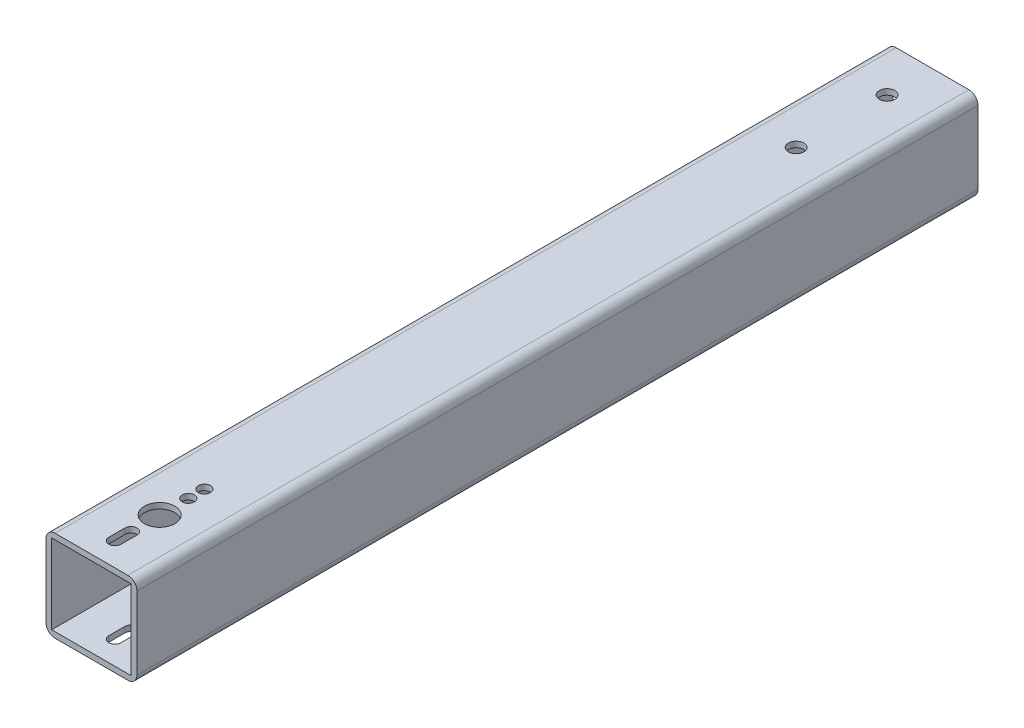
ISO-10303-21;
HEADER;
FILE_DESCRIPTION(('STEP AP214'),'2;1');
FILE_NAME('part.step','',(''),(''),'','','');
FILE_SCHEMA(('AUTOMOTIVE_DESIGN { 1 0 10303 214 1 1 1 1 }'));
ENDSEC;
DATA;
#1=APPLICATION_CONTEXT('core data for automotive mechanical design processes');
#2=APPLICATION_PROTOCOL_DEFINITION('international standard','automotive_design',2000,#1);
#3=PRODUCT_CONTEXT('',#1,'mechanical');
#4=PRODUCT('Part','Part','',(#3));
#5=PRODUCT_RELATED_PRODUCT_CATEGORY('part','',(#4));
#6=PRODUCT_DEFINITION_FORMATION('','',#4);
#7=PRODUCT_DEFINITION_CONTEXT('part definition',#1,'design');
#8=PRODUCT_DEFINITION('design','',#6,#7);
#9=PRODUCT_DEFINITION_SHAPE('','',#8);
#10=(LENGTH_UNIT() NAMED_UNIT(*) SI_UNIT(.MILLI.,.METRE.));
#11=(NAMED_UNIT(*) PLANE_ANGLE_UNIT() SI_UNIT($,.RADIAN.));
#12=(NAMED_UNIT(*) SI_UNIT($,.STERADIAN.) SOLID_ANGLE_UNIT());
#13=UNCERTAINTY_MEASURE_WITH_UNIT(LENGTH_MEASURE(1.E-05),#10,'distance_accuracy_value','');
#14=(GEOMETRIC_REPRESENTATION_CONTEXT(3) GLOBAL_UNCERTAINTY_ASSIGNED_CONTEXT((#13)) GLOBAL_UNIT_ASSIGNED_CONTEXT((#10,
#11,#12)) REPRESENTATION_CONTEXT('',''));
#15=CARTESIAN_POINT('',(0.,0.,0.));
#16=DIRECTION('',(0.,0.,1.));
#17=DIRECTION('',(1.,0.,0.));
#18=AXIS2_PLACEMENT_3D('',#15,#16,#17);
#19=CARTESIAN_POINT('',(0.,0.,234.95));
#20=DIRECTION('',(0.,0.,1.));
#21=DIRECTION('',(1.,0.,0.));
#22=AXIS2_PLACEMENT_3D('',#19,#20,#21);
#23=PLANE('',#22);
#24=DIRECTION('',(1.,0.,0.));
#25=VECTOR('',#24,1.);
#26=CARTESIAN_POINT('',(-24.2595918367347,-13.9751836734694,234.95));
#27=LINE('',#26,#25);
#28=CARTESIAN_POINT('',(-21.7195918367347,-13.9751836734694,234.95));
#29=VERTEX_POINT('',#28);
#30=CARTESIAN_POINT('',(-1.39959183673471,-13.9751836734694,234.95));
#31=VERTEX_POINT('',#30);
#32=EDGE_CURVE('E289',#29,#31,#27,.T.);
#33=ORIENTED_EDGE('',*,*,#32,.T.);
#34=CARTESIAN_POINT('',(-1.3995918367347,-11.4351836734694,234.95));
#35=DIRECTION('',(0.,0.,1.));
#36=DIRECTION('',(1.,0.,0.));
#37=AXIS2_PLACEMENT_3D('',#34,#35,#36);
#38=CIRCLE('',#37,2.54);
#39=CARTESIAN_POINT('',(1.1404081632653,-11.4351836734694,234.95));
#40=VERTEX_POINT('',#39);
#41=EDGE_CURVE('E333',#31,#40,#38,.T.);
#42=ORIENTED_EDGE('',*,*,#41,.T.);
#43=DIRECTION('',(0.,1.,0.));
#44=VECTOR('',#43,1.);
#45=CARTESIAN_POINT('',(1.1404081632653,11.4248163265306,234.95));
#46=LINE('',#45,#44);
#47=CARTESIAN_POINT('',(1.1404081632653,8.88481632653061,234.95));
#48=VERTEX_POINT('',#47);
#49=EDGE_CURVE('E293',#40,#48,#46,.T.);
#50=ORIENTED_EDGE('',*,*,#49,.T.);
#51=CARTESIAN_POINT('',(-1.3995918367347,8.88481632653061,234.95));
#52=DIRECTION('',(0.,0.,1.));
#53=DIRECTION('',(1.,0.,0.));
#54=AXIS2_PLACEMENT_3D('',#51,#52,#53);
#55=CIRCLE('',#54,2.54);
#56=CARTESIAN_POINT('',(-1.3995918367347,11.4248163265306,234.95));
#57=VERTEX_POINT('',#56);
#58=EDGE_CURVE('E327',#48,#57,#55,.T.);
#59=ORIENTED_EDGE('',*,*,#58,.T.);
#60=DIRECTION('',(-1.,0.,0.));
#61=VECTOR('',#60,1.);
#62=CARTESIAN_POINT('',(-24.2595918367347,11.4248163265306,234.95));
#63=LINE('',#62,#61);
#64=CARTESIAN_POINT('',(-21.7195918367347,11.4248163265306,234.95));
#65=VERTEX_POINT('',#64);
#66=EDGE_CURVE('E296',#57,#65,#63,.T.);
#67=ORIENTED_EDGE('',*,*,#66,.T.);
#68=CARTESIAN_POINT('',(-21.7195918367347,8.88481632653061,234.95));
#69=DIRECTION('',(0.,0.,1.));
#70=DIRECTION('',(1.,0.,0.));
#71=AXIS2_PLACEMENT_3D('',#68,#69,#70);
#72=CIRCLE('',#71,2.54);
#73=CARTESIAN_POINT('',(-24.2595918367347,8.88481632653061,234.95));
#74=VERTEX_POINT('',#73);
#75=EDGE_CURVE('E329',#65,#74,#72,.T.);
#76=ORIENTED_EDGE('',*,*,#75,.T.);
#77=DIRECTION('',(0.,-1.,0.));
#78=VECTOR('',#77,1.);
#79=CARTESIAN_POINT('',(-24.2595918367347,11.4248163265306,234.95));
#80=LINE('',#79,#78);
#81=CARTESIAN_POINT('',(-24.2595918367347,-11.4351836734694,234.95));
#82=VERTEX_POINT('',#81);
#83=EDGE_CURVE('E286',#74,#82,#80,.T.);
#84=ORIENTED_EDGE('',*,*,#83,.T.);
#85=CARTESIAN_POINT('',(-21.7195918367347,-11.4351836734694,234.95));
#86=DIRECTION('',(0.,0.,1.));
#87=DIRECTION('',(1.,0.,0.));
#88=AXIS2_PLACEMENT_3D('',#85,#86,#87);
#89=CIRCLE('',#88,2.54);
#90=EDGE_CURVE('E331',#82,#29,#89,.T.);
#91=ORIENTED_EDGE('',*,*,#90,.T.);
#92=EDGE_LOOP('',(#33,#42,#50,#59,#67,#76,#84,#91));
#93=FACE_BOUND('',#92,.T.);
#94=DIRECTION('',(1.,0.,0.));
#95=VECTOR('',#94,1.);
#96=CARTESIAN_POINT('',(-22.6720918367347,-12.3876836734694,234.95));
#97=LINE('',#96,#95);
#98=CARTESIAN_POINT('',(-22.6720918367347,-12.3876836734694,234.95));
#99=VERTEX_POINT('',#98);
#100=CARTESIAN_POINT('',(-0.447091836734699,-12.3876836734694,234.95));
#101=VERTEX_POINT('',#100);
#102=EDGE_CURVE('E257',#99,#101,#97,.T.);
#103=ORIENTED_EDGE('',*,*,#102,.F.);
#104=DIRECTION('',(0.,-1.,0.));
#105=VECTOR('',#104,1.);
#106=CARTESIAN_POINT('',(-22.6720918367347,9.83731632653061,234.95));
#107=LINE('',#106,#105);
#108=CARTESIAN_POINT('',(-22.6720918367347,9.83731632653061,234.95));
#109=VERTEX_POINT('',#108);
#110=EDGE_CURVE('E255',#109,#99,#107,.T.);
#111=ORIENTED_EDGE('',*,*,#110,.F.);
#112=DIRECTION('',(-1.,0.,0.));
#113=VECTOR('',#112,1.);
#114=CARTESIAN_POINT('',(-22.6720918367347,9.83731632653061,234.95));
#115=LINE('',#114,#113);
#116=CARTESIAN_POINT('',(-0.447091836734703,9.83731632653061,234.95));
#117=VERTEX_POINT('',#116);
#118=EDGE_CURVE('E263',#117,#109,#115,.T.);
#119=ORIENTED_EDGE('',*,*,#118,.F.);
#120=DIRECTION('',(0.,1.,0.));
#121=VECTOR('',#120,1.);
#122=CARTESIAN_POINT('',(-0.447091836734703,9.83731632653061,234.95));
#123=LINE('',#122,#121);
#124=EDGE_CURVE('E260',#101,#117,#123,.T.);
#125=ORIENTED_EDGE('',*,*,#124,.F.);
#126=EDGE_LOOP('',(#103,#111,#119,#125));
#127=FACE_BOUND('',#126,.T.);
#128=ADVANCED_FACE('F35',(#93,#127),#23,.T.);
#129=CARTESIAN_POINT('',(0.,0.,0.));
#130=DIRECTION('',(0.,0.,1.));
#131=DIRECTION('',(1.,0.,0.));
#132=AXIS2_PLACEMENT_3D('',#129,#130,#131);
#133=PLANE('',#132);
#134=DIRECTION('',(0.,1.,0.));
#135=VECTOR('',#134,1.);
#136=CARTESIAN_POINT('',(1.1404081632653,11.4248163265306,0.));
#137=LINE('',#136,#135);
#138=CARTESIAN_POINT('',(1.1404081632653,-11.4351836734694,0.));
#139=VERTEX_POINT('',#138);
#140=CARTESIAN_POINT('',(1.1404081632653,8.88481632653061,0.));
#141=VERTEX_POINT('',#140);
#142=EDGE_CURVE('E305',#139,#141,#137,.T.);
#143=ORIENTED_EDGE('',*,*,#142,.F.);
#144=CARTESIAN_POINT('',(-1.3995918367347,-11.4351836734694,0.));
#145=DIRECTION('',(0.,0.,1.));
#146=DIRECTION('',(1.,0.,0.));
#147=AXIS2_PLACEMENT_3D('',#144,#145,#146);
#148=CIRCLE('',#147,2.54);
#149=CARTESIAN_POINT('',(-1.39959183673471,-13.9751836734694,0.));
#150=VERTEX_POINT('',#149);
#151=EDGE_CURVE('E320',#139,#150,#148,.F.);
#152=ORIENTED_EDGE('',*,*,#151,.T.);
#153=DIRECTION('',(1.,0.,0.));
#154=VECTOR('',#153,1.);
#155=CARTESIAN_POINT('',(-24.2595918367347,-13.9751836734694,0.));
#156=LINE('',#155,#154);
#157=CARTESIAN_POINT('',(-21.7195918367347,-13.9751836734694,0.));
#158=VERTEX_POINT('',#157);
#159=EDGE_CURVE('E302',#158,#150,#156,.T.);
#160=ORIENTED_EDGE('',*,*,#159,.F.);
#161=CARTESIAN_POINT('',(-21.7195918367347,-11.4351836734694,0.));
#162=DIRECTION('',(0.,0.,1.));
#163=DIRECTION('',(1.,0.,0.));
#164=AXIS2_PLACEMENT_3D('',#161,#162,#163);
#165=CIRCLE('',#164,2.54);
#166=CARTESIAN_POINT('',(-24.2595918367347,-11.4351836734694,0.));
#167=VERTEX_POINT('',#166);
#168=EDGE_CURVE('E318',#158,#167,#165,.F.);
#169=ORIENTED_EDGE('',*,*,#168,.T.);
#170=DIRECTION('',(0.,-1.,0.));
#171=VECTOR('',#170,1.);
#172=CARTESIAN_POINT('',(-24.2595918367347,11.4248163265306,0.));
#173=LINE('',#172,#171);
#174=CARTESIAN_POINT('',(-24.2595918367347,8.88481632653061,0.));
#175=VERTEX_POINT('',#174);
#176=EDGE_CURVE('E285',#175,#167,#173,.T.);
#177=ORIENTED_EDGE('',*,*,#176,.F.);
#178=CARTESIAN_POINT('',(-21.7195918367347,8.88481632653061,0.));
#179=DIRECTION('',(0.,0.,1.));
#180=DIRECTION('',(1.,0.,0.));
#181=AXIS2_PLACEMENT_3D('',#178,#179,#180);
#182=CIRCLE('',#181,2.54);
#183=CARTESIAN_POINT('',(-21.7195918367347,11.4248163265306,0.));
#184=VERTEX_POINT('',#183);
#185=EDGE_CURVE('E316',#175,#184,#182,.F.);
#186=ORIENTED_EDGE('',*,*,#185,.T.);
#187=DIRECTION('',(-1.,0.,0.));
#188=VECTOR('',#187,1.);
#189=CARTESIAN_POINT('',(-24.2595918367347,11.4248163265306,0.));
#190=LINE('',#189,#188);
#191=CARTESIAN_POINT('',(-1.3995918367347,11.4248163265306,0.));
#192=VERTEX_POINT('',#191);
#193=EDGE_CURVE('E290',#192,#184,#190,.T.);
#194=ORIENTED_EDGE('',*,*,#193,.F.);
#195=CARTESIAN_POINT('',(-1.3995918367347,8.88481632653061,0.));
#196=DIRECTION('',(0.,0.,1.));
#197=DIRECTION('',(1.,0.,0.));
#198=AXIS2_PLACEMENT_3D('',#195,#196,#197);
#199=CIRCLE('',#198,2.54);
#200=EDGE_CURVE('E314',#192,#141,#199,.F.);
#201=ORIENTED_EDGE('',*,*,#200,.T.);
#202=EDGE_LOOP('',(#143,#152,#160,#169,#177,#186,#194,#201));
#203=FACE_BOUND('',#202,.T.);
#204=DIRECTION('',(0.,-1.,0.));
#205=VECTOR('',#204,1.);
#206=CARTESIAN_POINT('',(-22.6720918367347,9.83731632653061,0.));
#207=LINE('',#206,#205);
#208=CARTESIAN_POINT('',(-22.6720918367347,9.83731632653061,0.));
#209=VERTEX_POINT('',#208);
#210=CARTESIAN_POINT('',(-22.6720918367347,-12.3876836734694,0.));
#211=VERTEX_POINT('',#210);
#212=EDGE_CURVE('E254',#209,#211,#207,.T.);
#213=ORIENTED_EDGE('',*,*,#212,.T.);
#214=DIRECTION('',(1.,0.,0.));
#215=VECTOR('',#214,1.);
#216=CARTESIAN_POINT('',(-22.6720918367347,-12.3876836734694,0.));
#217=LINE('',#216,#215);
#218=CARTESIAN_POINT('',(-0.447091836734699,-12.3876836734694,0.));
#219=VERTEX_POINT('',#218);
#220=EDGE_CURVE('E268',#211,#219,#217,.T.);
#221=ORIENTED_EDGE('',*,*,#220,.T.);
#222=DIRECTION('',(0.,1.,0.));
#223=VECTOR('',#222,1.);
#224=CARTESIAN_POINT('',(-0.447091836734703,9.83731632653061,0.));
#225=LINE('',#224,#223);
#226=CARTESIAN_POINT('',(-0.447091836734703,9.83731632653061,0.));
#227=VERTEX_POINT('',#226);
#228=EDGE_CURVE('E271',#219,#227,#225,.T.);
#229=ORIENTED_EDGE('',*,*,#228,.T.);
#230=DIRECTION('',(-1.,0.,0.));
#231=VECTOR('',#230,1.);
#232=CARTESIAN_POINT('',(-22.6720918367347,9.83731632653061,0.));
#233=LINE('',#232,#231);
#234=EDGE_CURVE('E258',#227,#209,#233,.T.);
#235=ORIENTED_EDGE('',*,*,#234,.T.);
#236=EDGE_LOOP('',(#213,#221,#229,#235));
#237=FACE_BOUND('',#236,.T.);
#238=ADVANCED_FACE('F416',(#203,#237),#133,.F.);
#239=CARTESIAN_POINT('',(-24.2595918367347,11.4248163265306,234.95));
#240=DIRECTION('',(1.,0.,0.));
#241=DIRECTION('',(0.,0.,-1.));
#242=AXIS2_PLACEMENT_3D('',#239,#240,#241);
#243=PLANE('',#242);
#244=ORIENTED_EDGE('',*,*,#176,.T.);
#245=DIRECTION('',(0.,0.,-1.));
#246=VECTOR('',#245,1.);
#247=CARTESIAN_POINT('',(-24.2595918367347,-11.4351836734694,234.95));
#248=LINE('',#247,#246);
#249=EDGE_CURVE('E338',#167,#82,#248,.F.);
#250=ORIENTED_EDGE('',*,*,#249,.T.);
#251=ORIENTED_EDGE('',*,*,#83,.F.);
#252=DIRECTION('',(0.,0.,-1.));
#253=VECTOR('',#252,1.);
#254=CARTESIAN_POINT('',(-24.2595918367347,8.88481632653061,234.95));
#255=LINE('',#254,#253);
#256=EDGE_CURVE('E335',#74,#175,#255,.T.);
#257=ORIENTED_EDGE('',*,*,#256,.T.);
#258=EDGE_LOOP('',(#244,#250,#251,#257));
#259=FACE_BOUND('',#258,.T.);
#260=ADVANCED_FACE('F422',(#259),#243,.F.);
#261=CARTESIAN_POINT('',(-24.2595918367347,-13.9751836734694,234.95));
#262=DIRECTION('',(0.,1.,0.));
#263=DIRECTION('',(0.,0.,1.));
#264=AXIS2_PLACEMENT_3D('',#261,#262,#263);
#265=PLANE('',#264);
#266=CARTESIAN_POINT('',(-11.5595918367347,-13.9751836734694,203.4));
#267=DIRECTION('',(0.,1.,0.));
#268=DIRECTION('',(0.,0.,1.));
#269=AXIS2_PLACEMENT_3D('',#266,#267,#268);
#270=CIRCLE('',#269,1.7000000000001);
#271=CARTESIAN_POINT('',(-11.5595918367347,-13.9751836734694,205.1));
#272=VERTEX_POINT('',#271);
#273=EDGE_CURVE('E197',#272,#272,#270,.T.);
#274=ORIENTED_EDGE('',*,*,#273,.T.);
#275=EDGE_LOOP('',(#274));
#276=FACE_BOUND('',#275,.T.);
#277=CARTESIAN_POINT('',(-11.5595918367347,-13.9751836734694,215.9));
#278=DIRECTION('',(0.,1.,0.));
#279=DIRECTION('',(0.,0.,1.));
#280=AXIS2_PLACEMENT_3D('',#277,#278,#279);
#281=CIRCLE('',#280,4.25);
#282=CARTESIAN_POINT('',(-11.5595918367347,-13.9751836734694,220.15));
#283=VERTEX_POINT('',#282);
#284=EDGE_CURVE('E201',#283,#283,#281,.T.);
#285=ORIENTED_EDGE('',*,*,#284,.T.);
#286=EDGE_LOOP('',(#285));
#287=FACE_BOUND('',#286,.T.);
#288=DIRECTION('',(0.,0.,-1.));
#289=VECTOR('',#288,1.);
#290=CARTESIAN_POINT('',(-9.85959183673465,-13.9751836734694,223.9));
#291=LINE('',#290,#289);
#292=CARTESIAN_POINT('',(-9.85959183673465,-13.9751836734694,228.4));
#293=VERTEX_POINT('',#292);
#294=CARTESIAN_POINT('',(-9.85959183673465,-13.9751836734694,223.9));
#295=VERTEX_POINT('',#294);
#296=EDGE_CURVE('E383',#293,#295,#291,.T.);
#297=ORIENTED_EDGE('',*,*,#296,.T.);
#298=CARTESIAN_POINT('',(-11.5595918367347,-13.9751836734694,223.9));
#299=DIRECTION('',(0.,1.,0.));
#300=DIRECTION('',(0.,0.,1.));
#301=AXIS2_PLACEMENT_3D('',#298,#299,#300);
#302=CIRCLE('',#301,1.70000000000004);
#303=CARTESIAN_POINT('',(-13.2595918367347,-13.9751836734694,223.9));
#304=VERTEX_POINT('',#303);
#305=EDGE_CURVE('E388',#295,#304,#302,.T.);
#306=ORIENTED_EDGE('',*,*,#305,.T.);
#307=DIRECTION('',(0.,0.,1.));
#308=VECTOR('',#307,1.);
#309=CARTESIAN_POINT('',(-13.2595918367347,-13.9751836734694,223.9));
#310=LINE('',#309,#308);
#311=CARTESIAN_POINT('',(-13.2595918367347,-13.9751836734694,228.4));
#312=VERTEX_POINT('',#311);
#313=EDGE_CURVE('E176',#304,#312,#310,.T.);
#314=ORIENTED_EDGE('',*,*,#313,.T.);
#315=CARTESIAN_POINT('',(-11.5595918367347,-13.9751836734694,228.4));
#316=DIRECTION('',(0.,1.,0.));
#317=DIRECTION('',(0.,0.,1.));
#318=AXIS2_PLACEMENT_3D('',#315,#316,#317);
#319=CIRCLE('',#318,1.70000000000003);
#320=EDGE_CURVE('E53',#312,#293,#319,.T.);
#321=ORIENTED_EDGE('',*,*,#320,.T.);
#322=EDGE_LOOP('',(#297,#306,#314,#321));
#323=FACE_BOUND('',#322,.T.);
#324=CARTESIAN_POINT('',(-11.5595918367347,-13.9751836734694,207.9));
#325=DIRECTION('',(0.,1.,0.));
#326=DIRECTION('',(0.,0.,1.));
#327=AXIS2_PLACEMENT_3D('',#324,#325,#326);
#328=CIRCLE('',#327,1.70000000000005);
#329=CARTESIAN_POINT('',(-11.5595918367347,-13.9751836734694,209.6));
#330=VERTEX_POINT('',#329);
#331=EDGE_CURVE('E224',#330,#330,#328,.T.);
#332=ORIENTED_EDGE('',*,*,#331,.T.);
#333=EDGE_LOOP('',(#332));
#334=FACE_BOUND('',#333,.T.);
#335=CARTESIAN_POINT('',(-11.5595918367347,-13.9751836734694,38.1));
#336=DIRECTION('',(0.,1.,0.));
#337=DIRECTION('',(0.,0.,1.));
#338=AXIS2_PLACEMENT_3D('',#335,#336,#337);
#339=CIRCLE('',#338,2.159);
#340=CARTESIAN_POINT('',(-11.5595918367347,-13.9751836734694,40.259));
#341=VERTEX_POINT('',#340);
#342=EDGE_CURVE('E235',#341,#341,#339,.T.);
#343=ORIENTED_EDGE('',*,*,#342,.T.);
#344=EDGE_LOOP('',(#343));
#345=FACE_BOUND('',#344,.T.);
#346=CARTESIAN_POINT('',(-11.5595918367347,-13.9751836734694,12.7));
#347=DIRECTION('',(0.,1.,0.));
#348=DIRECTION('',(0.,0.,1.));
#349=AXIS2_PLACEMENT_3D('',#346,#347,#348);
#350=CIRCLE('',#349,2.159);
#351=CARTESIAN_POINT('',(-11.5595918367347,-13.9751836734694,14.859));
#352=VERTEX_POINT('',#351);
#353=EDGE_CURVE('E245',#352,#352,#350,.T.);
#354=ORIENTED_EDGE('',*,*,#353,.T.);
#355=EDGE_LOOP('',(#354));
#356=FACE_BOUND('',#355,.T.);
#357=ORIENTED_EDGE('',*,*,#159,.T.);
#358=DIRECTION('',(0.,0.,-1.));
#359=VECTOR('',#358,1.);
#360=CARTESIAN_POINT('',(-1.3995918367347,-13.9751836734694,234.95));
#361=LINE('',#360,#359);
#362=EDGE_CURVE('E325',#150,#31,#361,.F.);
#363=ORIENTED_EDGE('',*,*,#362,.T.);
#364=ORIENTED_EDGE('',*,*,#32,.F.);
#365=DIRECTION('',(0.,0.,-1.));
#366=VECTOR('',#365,1.);
#367=CARTESIAN_POINT('',(-21.7195918367347,-13.9751836734694,234.95));
#368=LINE('',#367,#366);
#369=EDGE_CURVE('E322',#29,#158,#368,.T.);
#370=ORIENTED_EDGE('',*,*,#369,.T.);
#371=EDGE_LOOP('',(#357,#363,#364,#370));
#372=FACE_BOUND('',#371,.T.);
#373=ADVANCED_FACE('F393',(#276,#287,#323,#334,#345,#356,#372),#265,.F.);
#374=CARTESIAN_POINT('',(1.1404081632653,11.4248163265306,234.95));
#375=DIRECTION('',(-1.,0.,0.));
#376=DIRECTION('',(0.,-1.,0.));
#377=AXIS2_PLACEMENT_3D('',#374,#375,#376);
#378=PLANE('',#377);
#379=ORIENTED_EDGE('',*,*,#49,.F.);
#380=DIRECTION('',(0.,0.,-1.));
#381=VECTOR('',#380,1.);
#382=CARTESIAN_POINT('',(1.1404081632653,-11.4351836734694,234.95));
#383=LINE('',#382,#381);
#384=EDGE_CURVE('E311',#40,#139,#383,.T.);
#385=ORIENTED_EDGE('',*,*,#384,.T.);
#386=ORIENTED_EDGE('',*,*,#142,.T.);
#387=DIRECTION('',(0.,0.,-1.));
#388=VECTOR('',#387,1.);
#389=CARTESIAN_POINT('',(1.1404081632653,8.88481632653061,234.95));
#390=LINE('',#389,#388);
#391=EDGE_CURVE('E299',#141,#48,#390,.F.);
#392=ORIENTED_EDGE('',*,*,#391,.T.);
#393=EDGE_LOOP('',(#379,#385,#386,#392));
#394=FACE_BOUND('',#393,.T.);
#395=ADVANCED_FACE('F432',(#394),#378,.F.);
#396=CARTESIAN_POINT('',(-24.2595918367347,11.4248163265306,234.95));
#397=DIRECTION('',(0.,-1.,0.));
#398=DIRECTION('',(0.,0.,-1.));
#399=AXIS2_PLACEMENT_3D('',#396,#397,#398);
#400=PLANE('',#399);
#401=CARTESIAN_POINT('',(-11.5595918367347,11.4248163265306,203.4));
#402=DIRECTION('',(0.,-1.,0.));
#403=DIRECTION('',(0.,0.,-1.));
#404=AXIS2_PLACEMENT_3D('',#401,#402,#403);
#405=CIRCLE('',#404,1.7000000000001);
#406=CARTESIAN_POINT('',(-11.5595918367347,11.4248163265306,201.7));
#407=VERTEX_POINT('',#406);
#408=EDGE_CURVE('E221',#407,#407,#405,.T.);
#409=ORIENTED_EDGE('',*,*,#408,.T.);
#410=EDGE_LOOP('',(#409));
#411=FACE_BOUND('',#410,.T.);
#412=CARTESIAN_POINT('',(-11.5595918367347,11.4248163265306,215.9));
#413=DIRECTION('',(0.,-1.,0.));
#414=DIRECTION('',(0.,0.,-1.));
#415=AXIS2_PLACEMENT_3D('',#412,#413,#414);
#416=CIRCLE('',#415,4.25);
#417=CARTESIAN_POINT('',(-11.5595918367347,11.4248163265306,211.65));
#418=VERTEX_POINT('',#417);
#419=EDGE_CURVE('E213',#418,#418,#416,.T.);
#420=ORIENTED_EDGE('',*,*,#419,.T.);
#421=EDGE_LOOP('',(#420));
#422=FACE_BOUND('',#421,.T.);
#423=DIRECTION('',(0.,0.,1.));
#424=VECTOR('',#423,1.);
#425=CARTESIAN_POINT('',(-13.2595918367347,11.4248163265306,223.9));
#426=LINE('',#425,#424);
#427=CARTESIAN_POINT('',(-13.2595918367347,11.4248163265306,223.9));
#428=VERTEX_POINT('',#427);
#429=CARTESIAN_POINT('',(-13.2595918367347,11.4248163265306,228.4));
#430=VERTEX_POINT('',#429);
#431=EDGE_CURVE('E196',#428,#430,#426,.T.);
#432=ORIENTED_EDGE('',*,*,#431,.F.);
#433=CARTESIAN_POINT('',(-11.5595918367347,11.4248163265306,223.9));
#434=DIRECTION('',(0.,1.,0.));
#435=DIRECTION('',(0.,0.,1.));
#436=AXIS2_PLACEMENT_3D('',#433,#434,#435);
#437=CIRCLE('',#436,1.70000000000004);
#438=CARTESIAN_POINT('',(-9.85959183673465,11.4248163265306,223.9));
#439=VERTEX_POINT('',#438);
#440=EDGE_CURVE('E39',#439,#428,#437,.T.);
#441=ORIENTED_EDGE('',*,*,#440,.F.);
#442=DIRECTION('',(0.,0.,-1.));
#443=VECTOR('',#442,1.);
#444=CARTESIAN_POINT('',(-9.85959183673465,11.4248163265306,223.9));
#445=LINE('',#444,#443);
#446=CARTESIAN_POINT('',(-9.85959183673465,11.4248163265306,228.4));
#447=VERTEX_POINT('',#446);
#448=EDGE_CURVE('E77',#447,#439,#445,.T.);
#449=ORIENTED_EDGE('',*,*,#448,.F.);
#450=CARTESIAN_POINT('',(-11.5595918367347,11.4248163265306,228.4));
#451=DIRECTION('',(0.,1.,0.));
#452=DIRECTION('',(0.,0.,1.));
#453=AXIS2_PLACEMENT_3D('',#450,#451,#452);
#454=CIRCLE('',#453,1.70000000000003);
#455=EDGE_CURVE('E207',#430,#447,#454,.T.);
#456=ORIENTED_EDGE('',*,*,#455,.F.);
#457=EDGE_LOOP('',(#432,#441,#449,#456));
#458=FACE_BOUND('',#457,.T.);
#459=CARTESIAN_POINT('',(-11.5595918367347,11.4248163265306,207.9));
#460=DIRECTION('',(0.,-1.,0.));
#461=DIRECTION('',(0.,0.,-1.));
#462=AXIS2_PLACEMENT_3D('',#459,#460,#461);
#463=CIRCLE('',#462,1.70000000000005);
#464=CARTESIAN_POINT('',(-11.5595918367347,11.4248163265306,206.2));
#465=VERTEX_POINT('',#464);
#466=EDGE_CURVE('E231',#465,#465,#463,.T.);
#467=ORIENTED_EDGE('',*,*,#466,.T.);
#468=EDGE_LOOP('',(#467));
#469=FACE_BOUND('',#468,.T.);
#470=CARTESIAN_POINT('',(-11.5595918367347,11.4248163265306,38.1));
#471=DIRECTION('',(0.,1.,0.));
#472=DIRECTION('',(0.,0.,1.));
#473=AXIS2_PLACEMENT_3D('',#470,#471,#472);
#474=CIRCLE('',#473,2.159);
#475=CARTESIAN_POINT('',(-11.5595918367347,11.4248163265306,40.259));
#476=VERTEX_POINT('',#475);
#477=EDGE_CURVE('E234',#476,#476,#474,.T.);
#478=ORIENTED_EDGE('',*,*,#477,.F.);
#479=EDGE_LOOP('',(#478));
#480=FACE_BOUND('',#479,.T.);
#481=CARTESIAN_POINT('',(-11.5595918367347,11.4248163265306,12.7));
#482=DIRECTION('',(0.,1.,0.));
#483=DIRECTION('',(0.,0.,1.));
#484=AXIS2_PLACEMENT_3D('',#481,#482,#483);
#485=CIRCLE('',#484,2.159);
#486=CARTESIAN_POINT('',(-11.5595918367347,11.4248163265306,14.859));
#487=VERTEX_POINT('',#486);
#488=EDGE_CURVE('E244',#487,#487,#485,.T.);
#489=ORIENTED_EDGE('',*,*,#488,.F.);
#490=EDGE_LOOP('',(#489));
#491=FACE_BOUND('',#490,.T.);
#492=ORIENTED_EDGE('',*,*,#193,.T.);
#493=DIRECTION('',(0.,0.,-1.));
#494=VECTOR('',#493,1.);
#495=CARTESIAN_POINT('',(-21.7195918367347,11.4248163265306,234.95));
#496=LINE('',#495,#494);
#497=EDGE_CURVE('E343',#184,#65,#496,.F.);
#498=ORIENTED_EDGE('',*,*,#497,.T.);
#499=ORIENTED_EDGE('',*,*,#66,.F.);
#500=DIRECTION('',(0.,0.,-1.));
#501=VECTOR('',#500,1.);
#502=CARTESIAN_POINT('',(-1.3995918367347,11.4248163265306,234.95));
#503=LINE('',#502,#501);
#504=EDGE_CURVE('E340',#57,#192,#503,.T.);
#505=ORIENTED_EDGE('',*,*,#504,.T.);
#506=EDGE_LOOP('',(#492,#498,#499,#505));
#507=FACE_BOUND('',#506,.T.);
#508=ADVANCED_FACE('F374',(#411,#422,#458,#469,#480,#491,#507),#400,.F.);
#509=CARTESIAN_POINT('',(-22.6720918367347,9.83731632653061,234.95));
#510=DIRECTION('',(1.,0.,0.));
#511=DIRECTION('',(0.,1.,0.));
#512=AXIS2_PLACEMENT_3D('',#509,#510,#511);
#513=PLANE('',#512);
#514=ORIENTED_EDGE('',*,*,#212,.F.);
#515=DIRECTION('',(0.,0.,-1.));
#516=VECTOR('',#515,1.);
#517=CARTESIAN_POINT('',(-22.6720918367347,9.83731632653061,234.95));
#518=LINE('',#517,#516);
#519=EDGE_CURVE('E265',#109,#209,#518,.T.);
#520=ORIENTED_EDGE('',*,*,#519,.F.);
#521=ORIENTED_EDGE('',*,*,#110,.T.);
#522=DIRECTION('',(0.,0.,-1.));
#523=VECTOR('',#522,1.);
#524=CARTESIAN_POINT('',(-22.6720918367347,-12.3876836734694,234.95));
#525=LINE('',#524,#523);
#526=EDGE_CURVE('E282',#99,#211,#525,.T.);
#527=ORIENTED_EDGE('',*,*,#526,.T.);
#528=EDGE_LOOP('',(#514,#520,#521,#527));
#529=FACE_BOUND('',#528,.T.);
#530=ADVANCED_FACE('F427',(#529),#513,.T.);
#531=CARTESIAN_POINT('',(-22.6720918367347,-12.3876836734694,234.95));
#532=DIRECTION('',(0.,1.,0.));
#533=DIRECTION('',(0.,0.,1.));
#534=AXIS2_PLACEMENT_3D('',#531,#532,#533);
#535=PLANE('',#534);
#536=CARTESIAN_POINT('',(-11.5595918367347,-12.3876836734694,203.4));
#537=DIRECTION('',(0.,1.,0.));
#538=DIRECTION('',(0.,0.,1.));
#539=AXIS2_PLACEMENT_3D('',#536,#537,#538);
#540=CIRCLE('',#539,1.7000000000001);
#541=CARTESIAN_POINT('',(-11.5595918367347,-12.3876836734694,205.1));
#542=VERTEX_POINT('',#541);
#543=EDGE_CURVE('E218',#542,#542,#540,.T.);
#544=ORIENTED_EDGE('',*,*,#543,.F.);
#545=EDGE_LOOP('',(#544));
#546=FACE_BOUND('',#545,.T.);
#547=CARTESIAN_POINT('',(-11.5595918367347,-12.3876836734694,215.9));
#548=DIRECTION('',(0.,1.,0.));
#549=DIRECTION('',(0.,0.,1.));
#550=AXIS2_PLACEMENT_3D('',#547,#548,#549);
#551=CIRCLE('',#550,4.25);
#552=CARTESIAN_POINT('',(-11.5595918367347,-12.3876836734694,220.15));
#553=VERTEX_POINT('',#552);
#554=EDGE_CURVE('E210',#553,#553,#551,.T.);
#555=ORIENTED_EDGE('',*,*,#554,.F.);
#556=EDGE_LOOP('',(#555));
#557=FACE_BOUND('',#556,.T.);
#558=CARTESIAN_POINT('',(-11.5595918367347,-12.3876836734694,223.9));
#559=DIRECTION('',(0.,1.,0.));
#560=DIRECTION('',(0.,0.,1.));
#561=AXIS2_PLACEMENT_3D('',#558,#559,#560);
#562=CIRCLE('',#561,1.70000000000004);
#563=CARTESIAN_POINT('',(-9.85959183673465,-12.3876836734694,223.9));
#564=VERTEX_POINT('',#563);
#565=CARTESIAN_POINT('',(-13.2595918367347,-12.3876836734694,223.9));
#566=VERTEX_POINT('',#565);
#567=EDGE_CURVE('E184',#564,#566,#562,.T.);
#568=ORIENTED_EDGE('',*,*,#567,.F.);
#569=DIRECTION('',(0.,0.,-1.));
#570=VECTOR('',#569,1.);
#571=CARTESIAN_POINT('',(-9.85959183673466,-12.3876836734694,234.95));
#572=LINE('',#571,#570);
#573=CARTESIAN_POINT('',(-9.85959183673465,-12.3876836734694,228.4));
#574=VERTEX_POINT('',#573);
#575=EDGE_CURVE('E208',#574,#564,#572,.T.);
#576=ORIENTED_EDGE('',*,*,#575,.F.);
#577=CARTESIAN_POINT('',(-11.5595918367347,-12.3876836734694,228.4));
#578=DIRECTION('',(0.,1.,0.));
#579=DIRECTION('',(0.,0.,1.));
#580=AXIS2_PLACEMENT_3D('',#577,#578,#579);
#581=CIRCLE('',#580,1.70000000000003);
#582=CARTESIAN_POINT('',(-13.2595918367347,-12.3876836734694,228.4));
#583=VERTEX_POINT('',#582);
#584=EDGE_CURVE('E195',#583,#574,#581,.T.);
#585=ORIENTED_EDGE('',*,*,#584,.F.);
#586=DIRECTION('',(0.,0.,1.));
#587=VECTOR('',#586,1.);
#588=CARTESIAN_POINT('',(-13.2595918367347,-12.3876836734694,234.95));
#589=LINE('',#588,#587);
#590=EDGE_CURVE('E173',#566,#583,#589,.T.);
#591=ORIENTED_EDGE('',*,*,#590,.F.);
#592=EDGE_LOOP('',(#568,#576,#585,#591));
#593=FACE_BOUND('',#592,.T.);
#594=CARTESIAN_POINT('',(-11.5595918367347,-12.3876836734694,207.9));
#595=DIRECTION('',(0.,1.,0.));
#596=DIRECTION('',(0.,0.,1.));
#597=AXIS2_PLACEMENT_3D('',#594,#595,#596);
#598=CIRCLE('',#597,1.70000000000005);
#599=CARTESIAN_POINT('',(-11.5595918367347,-12.3876836734694,209.6));
#600=VERTEX_POINT('',#599);
#601=EDGE_CURVE('E228',#600,#600,#598,.T.);
#602=ORIENTED_EDGE('',*,*,#601,.F.);
#603=EDGE_LOOP('',(#602));
#604=FACE_BOUND('',#603,.T.);
#605=CARTESIAN_POINT('',(-11.5595918367347,-12.3876836734694,38.1));
#606=DIRECTION('',(0.,1.,0.));
#607=DIRECTION('',(0.,0.,1.));
#608=AXIS2_PLACEMENT_3D('',#605,#606,#607);
#609=CIRCLE('',#608,2.159);
#610=CARTESIAN_POINT('',(-11.5595918367347,-12.3876836734694,40.259));
#611=VERTEX_POINT('',#610);
#612=EDGE_CURVE('E241',#611,#611,#609,.T.);
#613=ORIENTED_EDGE('',*,*,#612,.F.);
#614=EDGE_LOOP('',(#613));
#615=FACE_BOUND('',#614,.T.);
#616=CARTESIAN_POINT('',(-11.5595918367347,-12.3876836734694,12.7));
#617=DIRECTION('',(0.,1.,0.));
#618=DIRECTION('',(0.,0.,1.));
#619=AXIS2_PLACEMENT_3D('',#616,#617,#618);
#620=CIRCLE('',#619,2.159);
#621=CARTESIAN_POINT('',(-11.5595918367347,-12.3876836734694,14.859));
#622=VERTEX_POINT('',#621);
#623=EDGE_CURVE('E251',#622,#622,#620,.T.);
#624=ORIENTED_EDGE('',*,*,#623,.F.);
#625=EDGE_LOOP('',(#624));
#626=FACE_BOUND('',#625,.T.);
#627=ORIENTED_EDGE('',*,*,#220,.F.);
#628=ORIENTED_EDGE('',*,*,#526,.F.);
#629=ORIENTED_EDGE('',*,*,#102,.T.);
#630=DIRECTION('',(0.,0.,-1.));
#631=VECTOR('',#630,1.);
#632=CARTESIAN_POINT('',(-0.447091836734699,-12.3876836734694,234.95));
#633=LINE('',#632,#631);
#634=EDGE_CURVE('E280',#101,#219,#633,.T.);
#635=ORIENTED_EDGE('',*,*,#634,.T.);
#636=EDGE_LOOP('',(#627,#628,#629,#635));
#637=FACE_BOUND('',#636,.T.);
#638=ADVANCED_FACE('F192',(#546,#557,#593,#604,#615,#626,#637),#535,.T.);
#639=CARTESIAN_POINT('',(-0.447091836734703,9.83731632653061,234.95));
#640=DIRECTION('',(-1.,0.,0.));
#641=DIRECTION('',(0.,-1.,0.));
#642=AXIS2_PLACEMENT_3D('',#639,#640,#641);
#643=PLANE('',#642);
#644=ORIENTED_EDGE('',*,*,#228,.F.);
#645=ORIENTED_EDGE('',*,*,#634,.F.);
#646=ORIENTED_EDGE('',*,*,#124,.T.);
#647=DIRECTION('',(0.,0.,-1.));
#648=VECTOR('',#647,1.);
#649=CARTESIAN_POINT('',(-0.447091836734703,9.83731632653061,234.95));
#650=LINE('',#649,#648);
#651=EDGE_CURVE('E278',#117,#227,#650,.T.);
#652=ORIENTED_EDGE('',*,*,#651,.T.);
#653=EDGE_LOOP('',(#644,#645,#646,#652));
#654=FACE_BOUND('',#653,.T.);
#655=ADVANCED_FACE('F495',(#654),#643,.T.);
#656=CARTESIAN_POINT('',(-22.6720918367347,9.83731632653061,234.95));
#657=DIRECTION('',(0.,-1.,0.));
#658=DIRECTION('',(0.,0.,-1.));
#659=AXIS2_PLACEMENT_3D('',#656,#657,#658);
#660=PLANE('',#659);
#661=CARTESIAN_POINT('',(-11.5595918367347,9.83731632653062,203.4));
#662=DIRECTION('',(0.,-1.,0.));
#663=DIRECTION('',(0.,0.,-1.));
#664=AXIS2_PLACEMENT_3D('',#661,#662,#663);
#665=CIRCLE('',#664,1.7000000000001);
#666=CARTESIAN_POINT('',(-11.5595918367347,9.83731632653062,201.7));
#667=VERTEX_POINT('',#666);
#668=EDGE_CURVE('E217',#667,#667,#665,.T.);
#669=ORIENTED_EDGE('',*,*,#668,.F.);
#670=EDGE_LOOP('',(#669));
#671=FACE_BOUND('',#670,.T.);
#672=CARTESIAN_POINT('',(-11.5595918367347,9.83731632653062,215.9));
#673=DIRECTION('',(0.,-1.,0.));
#674=DIRECTION('',(0.,0.,-1.));
#675=AXIS2_PLACEMENT_3D('',#672,#673,#674);
#676=CIRCLE('',#675,4.25);
#677=CARTESIAN_POINT('',(-11.5595918367347,9.83731632653062,211.65));
#678=VERTEX_POINT('',#677);
#679=EDGE_CURVE('E214',#678,#678,#676,.T.);
#680=ORIENTED_EDGE('',*,*,#679,.F.);
#681=EDGE_LOOP('',(#680));
#682=FACE_BOUND('',#681,.T.);
#683=CARTESIAN_POINT('',(-11.5595918367347,9.83731632653062,223.9));
#684=DIRECTION('',(0.,-1.,0.));
#685=DIRECTION('',(0.,0.,-1.));
#686=AXIS2_PLACEMENT_3D('',#683,#684,#685);
#687=CIRCLE('',#686,1.70000000000004);
#688=CARTESIAN_POINT('',(-13.2595918367347,9.83731632653062,223.9));
#689=VERTEX_POINT('',#688);
#690=CARTESIAN_POINT('',(-9.85959183673465,9.83731632653062,223.9));
#691=VERTEX_POINT('',#690);
#692=EDGE_CURVE('E11',#689,#691,#687,.T.);
#693=ORIENTED_EDGE('',*,*,#692,.F.);
#694=DIRECTION('',(0.,0.,-1.));
#695=VECTOR('',#694,1.);
#696=CARTESIAN_POINT('',(-13.2595918367347,9.83731632653061,234.95));
#697=LINE('',#696,#695);
#698=CARTESIAN_POINT('',(-13.2595918367347,9.83731632653061,228.4));
#699=VERTEX_POINT('',#698);
#700=EDGE_CURVE('E345',#699,#689,#697,.T.);
#701=ORIENTED_EDGE('',*,*,#700,.F.);
#702=CARTESIAN_POINT('',(-11.5595918367347,9.83731632653062,228.4));
#703=DIRECTION('',(0.,-1.,0.));
#704=DIRECTION('',(0.,0.,-1.));
#705=AXIS2_PLACEMENT_3D('',#702,#703,#704);
#706=CIRCLE('',#705,1.70000000000003);
#707=CARTESIAN_POINT('',(-9.85959183673465,9.83731632653062,228.4));
#708=VERTEX_POINT('',#707);
#709=EDGE_CURVE('E353',#708,#699,#706,.T.);
#710=ORIENTED_EDGE('',*,*,#709,.F.);
#711=DIRECTION('',(0.,0.,1.));
#712=VECTOR('',#711,1.);
#713=CARTESIAN_POINT('',(-9.85959183673466,9.83731632653061,234.95));
#714=LINE('',#713,#712);
#715=EDGE_CURVE('E45',#691,#708,#714,.T.);
#716=ORIENTED_EDGE('',*,*,#715,.F.);
#717=EDGE_LOOP('',(#693,#701,#710,#716));
#718=FACE_BOUND('',#717,.T.);
#719=CARTESIAN_POINT('',(-11.5595918367347,9.83731632653062,207.9));
#720=DIRECTION('',(0.,-1.,0.));
#721=DIRECTION('',(0.,0.,-1.));
#722=AXIS2_PLACEMENT_3D('',#719,#720,#721);
#723=CIRCLE('',#722,1.70000000000005);
#724=CARTESIAN_POINT('',(-11.5595918367347,9.83731632653062,206.2));
#725=VERTEX_POINT('',#724);
#726=EDGE_CURVE('E227',#725,#725,#723,.T.);
#727=ORIENTED_EDGE('',*,*,#726,.F.);
#728=EDGE_LOOP('',(#727));
#729=FACE_BOUND('',#728,.T.);
#730=CARTESIAN_POINT('',(-11.5595918367347,9.83731632653062,38.1));
#731=DIRECTION('',(0.,-1.,0.));
#732=DIRECTION('',(0.,0.,-1.));
#733=AXIS2_PLACEMENT_3D('',#730,#731,#732);
#734=CIRCLE('',#733,2.159);
#735=CARTESIAN_POINT('',(-11.5595918367347,9.83731632653062,35.941));
#736=VERTEX_POINT('',#735);
#737=EDGE_CURVE('E238',#736,#736,#734,.T.);
#738=ORIENTED_EDGE('',*,*,#737,.F.);
#739=EDGE_LOOP('',(#738));
#740=FACE_BOUND('',#739,.T.);
#741=CARTESIAN_POINT('',(-11.5595918367347,9.83731632653062,12.7));
#742=DIRECTION('',(0.,-1.,0.));
#743=DIRECTION('',(0.,0.,-1.));
#744=AXIS2_PLACEMENT_3D('',#741,#742,#743);
#745=CIRCLE('',#744,2.159);
#746=CARTESIAN_POINT('',(-11.5595918367347,9.83731632653062,10.541));
#747=VERTEX_POINT('',#746);
#748=EDGE_CURVE('E248',#747,#747,#745,.T.);
#749=ORIENTED_EDGE('',*,*,#748,.F.);
#750=EDGE_LOOP('',(#749));
#751=FACE_BOUND('',#750,.T.);
#752=ORIENTED_EDGE('',*,*,#234,.F.);
#753=ORIENTED_EDGE('',*,*,#651,.F.);
#754=ORIENTED_EDGE('',*,*,#118,.T.);
#755=ORIENTED_EDGE('',*,*,#519,.T.);
#756=EDGE_LOOP('',(#752,#753,#754,#755));
#757=FACE_BOUND('',#756,.T.);
#758=ADVANCED_FACE('F447',(#671,#682,#718,#729,#740,#751,#757),#660,.T.);
#759=CARTESIAN_POINT('',(-1.3995918367347,-11.4351836734694,234.95));
#760=DIRECTION('',(0.,0.,-1.));
#761=DIRECTION('',(-1.,0.,0.));
#762=AXIS2_PLACEMENT_3D('',#759,#760,#761);
#763=CYLINDRICAL_SURFACE('',#762,2.54);
#764=ORIENTED_EDGE('',*,*,#41,.F.);
#765=ORIENTED_EDGE('',*,*,#362,.F.);
#766=ORIENTED_EDGE('',*,*,#151,.F.);
#767=ORIENTED_EDGE('',*,*,#384,.F.);
#768=EDGE_LOOP('',(#764,#765,#766,#767));
#769=FACE_BOUND('',#768,.T.);
#770=ADVANCED_FACE('F443',(#769),#763,.T.);
#771=CARTESIAN_POINT('',(-21.7195918367347,-11.4351836734694,234.95));
#772=DIRECTION('',(0.,0.,-1.));
#773=DIRECTION('',(-1.,0.,0.));
#774=AXIS2_PLACEMENT_3D('',#771,#772,#773);
#775=CYLINDRICAL_SURFACE('',#774,2.54);
#776=ORIENTED_EDGE('',*,*,#90,.F.);
#777=ORIENTED_EDGE('',*,*,#249,.F.);
#778=ORIENTED_EDGE('',*,*,#168,.F.);
#779=ORIENTED_EDGE('',*,*,#369,.F.);
#780=EDGE_LOOP('',(#776,#777,#778,#779));
#781=FACE_BOUND('',#780,.T.);
#782=ADVANCED_FACE('F446',(#781),#775,.T.);
#783=CARTESIAN_POINT('',(-21.7195918367347,8.88481632653061,234.95));
#784=DIRECTION('',(0.,0.,-1.));
#785=DIRECTION('',(-1.,0.,0.));
#786=AXIS2_PLACEMENT_3D('',#783,#784,#785);
#787=CYLINDRICAL_SURFACE('',#786,2.54);
#788=ORIENTED_EDGE('',*,*,#75,.F.);
#789=ORIENTED_EDGE('',*,*,#497,.F.);
#790=ORIENTED_EDGE('',*,*,#185,.F.);
#791=ORIENTED_EDGE('',*,*,#256,.F.);
#792=EDGE_LOOP('',(#788,#789,#790,#791));
#793=FACE_BOUND('',#792,.T.);
#794=ADVANCED_FACE('F450',(#793),#787,.T.);
#795=CARTESIAN_POINT('',(-1.3995918367347,8.88481632653061,234.95));
#796=DIRECTION('',(0.,0.,-1.));
#797=DIRECTION('',(-1.,0.,0.));
#798=AXIS2_PLACEMENT_3D('',#795,#796,#797);
#799=CYLINDRICAL_SURFACE('',#798,2.54);
#800=ORIENTED_EDGE('',*,*,#58,.F.);
#801=ORIENTED_EDGE('',*,*,#391,.F.);
#802=ORIENTED_EDGE('',*,*,#200,.F.);
#803=ORIENTED_EDGE('',*,*,#504,.F.);
#804=EDGE_LOOP('',(#800,#801,#802,#803));
#805=FACE_BOUND('',#804,.T.);
#806=ADVANCED_FACE('F37',(#805),#799,.T.);
#807=CARTESIAN_POINT('',(-11.5595918367347,-13.9751836734694,12.7));
#808=DIRECTION('',(0.,1.,0.));
#809=DIRECTION('',(0.,0.,1.));
#810=AXIS2_PLACEMENT_3D('',#807,#808,#809);
#811=CYLINDRICAL_SURFACE('',#810,2.159);
#812=ORIENTED_EDGE('',*,*,#748,.T.);
#813=EDGE_LOOP('',(#812));
#814=FACE_BOUND('',#813,.T.);
#815=ORIENTED_EDGE('',*,*,#488,.T.);
#816=EDGE_LOOP('',(#815));
#817=FACE_BOUND('',#816,.T.);
#818=ADVANCED_FACE('F457',(#814,#817),#811,.F.);
#819=ORIENTED_EDGE('',*,*,#623,.T.);
#820=EDGE_LOOP('',(#819));
#821=FACE_BOUND('',#820,.T.);
#822=ORIENTED_EDGE('',*,*,#353,.F.);
#823=EDGE_LOOP('',(#822));
#824=FACE_BOUND('',#823,.T.);
#825=ADVANCED_FACE('F508',(#821,#824),#811,.F.);
#826=CARTESIAN_POINT('',(-11.5595918367347,-13.9751836734694,38.1));
#827=DIRECTION('',(0.,1.,0.));
#828=DIRECTION('',(0.,0.,1.));
#829=AXIS2_PLACEMENT_3D('',#826,#827,#828);
#830=CYLINDRICAL_SURFACE('',#829,2.159);
#831=ORIENTED_EDGE('',*,*,#737,.T.);
#832=EDGE_LOOP('',(#831));
#833=FACE_BOUND('',#832,.T.);
#834=ORIENTED_EDGE('',*,*,#477,.T.);
#835=EDGE_LOOP('',(#834));
#836=FACE_BOUND('',#835,.T.);
#837=ADVANCED_FACE('F510',(#833,#836),#830,.F.);
#838=ORIENTED_EDGE('',*,*,#612,.T.);
#839=EDGE_LOOP('',(#838));
#840=FACE_BOUND('',#839,.T.);
#841=ORIENTED_EDGE('',*,*,#342,.F.);
#842=EDGE_LOOP('',(#841));
#843=FACE_BOUND('',#842,.T.);
#844=ADVANCED_FACE('F513',(#840,#843),#830,.F.);
#845=CARTESIAN_POINT('',(-11.5595918367347,-13.9751836734694,207.9));
#846=DIRECTION('',(0.,1.,0.));
#847=DIRECTION('',(0.,0.,1.));
#848=AXIS2_PLACEMENT_3D('',#845,#846,#847);
#849=CYLINDRICAL_SURFACE('',#848,1.70000000000005);
#850=ORIENTED_EDGE('',*,*,#726,.T.);
#851=EDGE_LOOP('',(#850));
#852=FACE_BOUND('',#851,.T.);
#853=ORIENTED_EDGE('',*,*,#466,.F.);
#854=EDGE_LOOP('',(#853));
#855=FACE_BOUND('',#854,.T.);
#856=ADVANCED_FACE('F515',(#852,#855),#849,.F.);
#857=ORIENTED_EDGE('',*,*,#601,.T.);
#858=EDGE_LOOP('',(#857));
#859=FACE_BOUND('',#858,.T.);
#860=ORIENTED_EDGE('',*,*,#331,.F.);
#861=EDGE_LOOP('',(#860));
#862=FACE_BOUND('',#861,.T.);
#863=ADVANCED_FACE('F518',(#859,#862),#849,.F.);
#864=CARTESIAN_POINT('',(-13.2595918367347,-13.9751836734694,223.9));
#865=DIRECTION('',(-1.,0.,0.));
#866=DIRECTION('',(0.,0.,1.));
#867=AXIS2_PLACEMENT_3D('',#864,#865,#866);
#868=PLANE('',#867);
#869=DIRECTION('',(0.,1.,0.));
#870=VECTOR('',#869,1.);
#871=CARTESIAN_POINT('',(-13.2595918367347,-13.9751836734694,228.4));
#872=LINE('',#871,#870);
#873=EDGE_CURVE('E162',#699,#430,#872,.T.);
#874=ORIENTED_EDGE('',*,*,#873,.F.);
#875=ORIENTED_EDGE('',*,*,#700,.T.);
#876=DIRECTION('',(0.,1.,0.));
#877=VECTOR('',#876,1.);
#878=CARTESIAN_POINT('',(-13.2595918367347,-13.9751836734694,223.9));
#879=LINE('',#878,#877);
#880=EDGE_CURVE('E180',#689,#428,#879,.T.);
#881=ORIENTED_EDGE('',*,*,#880,.T.);
#882=ORIENTED_EDGE('',*,*,#431,.T.);
#883=EDGE_LOOP('',(#874,#875,#881,#882));
#884=FACE_BOUND('',#883,.T.);
#885=ADVANCED_FACE('F411',(#884),#868,.F.);
#886=CARTESIAN_POINT('',(-11.5595918367347,-13.9751836734694,228.4));
#887=DIRECTION('',(0.,1.,0.));
#888=DIRECTION('',(0.,0.,1.));
#889=AXIS2_PLACEMENT_3D('',#886,#887,#888);
#890=CYLINDRICAL_SURFACE('',#889,1.70000000000003);
#891=DIRECTION('',(0.,1.,0.));
#892=VECTOR('',#891,1.);
#893=CARTESIAN_POINT('',(-9.85959183673465,-13.9751836734694,228.4));
#894=LINE('',#893,#892);
#895=EDGE_CURVE('E365',#708,#447,#894,.T.);
#896=ORIENTED_EDGE('',*,*,#895,.F.);
#897=ORIENTED_EDGE('',*,*,#709,.T.);
#898=ORIENTED_EDGE('',*,*,#873,.T.);
#899=ORIENTED_EDGE('',*,*,#455,.T.);
#900=EDGE_LOOP('',(#896,#897,#898,#899));
#901=FACE_BOUND('',#900,.T.);
#902=ADVANCED_FACE('F364',(#901),#890,.F.);
#903=CARTESIAN_POINT('',(-9.85959183673465,-13.9751836734694,223.9));
#904=DIRECTION('',(1.,0.,0.));
#905=DIRECTION('',(0.,0.,-1.));
#906=AXIS2_PLACEMENT_3D('',#903,#904,#905);
#907=PLANE('',#906);
#908=DIRECTION('',(0.,1.,0.));
#909=VECTOR('',#908,1.);
#910=CARTESIAN_POINT('',(-9.85959183673465,-13.9751836734694,223.9));
#911=LINE('',#910,#909);
#912=EDGE_CURVE('E379',#691,#439,#911,.T.);
#913=ORIENTED_EDGE('',*,*,#912,.F.);
#914=ORIENTED_EDGE('',*,*,#715,.T.);
#915=ORIENTED_EDGE('',*,*,#895,.T.);
#916=ORIENTED_EDGE('',*,*,#448,.T.);
#917=EDGE_LOOP('',(#913,#914,#915,#916));
#918=FACE_BOUND('',#917,.T.);
#919=ADVANCED_FACE('F369',(#918),#907,.F.);
#920=CARTESIAN_POINT('',(-11.5595918367347,-13.9751836734694,223.9));
#921=DIRECTION('',(0.,1.,0.));
#922=DIRECTION('',(0.,0.,1.));
#923=AXIS2_PLACEMENT_3D('',#920,#921,#922);
#924=CYLINDRICAL_SURFACE('',#923,1.70000000000004);
#925=ORIENTED_EDGE('',*,*,#880,.F.);
#926=ORIENTED_EDGE('',*,*,#692,.T.);
#927=ORIENTED_EDGE('',*,*,#912,.T.);
#928=ORIENTED_EDGE('',*,*,#440,.T.);
#929=EDGE_LOOP('',(#925,#926,#927,#928));
#930=FACE_BOUND('',#929,.T.);
#931=ADVANCED_FACE('F377',(#930),#924,.F.);
#932=CARTESIAN_POINT('',(-11.5595918367347,-13.9751836734694,215.9));
#933=DIRECTION('',(0.,1.,0.));
#934=DIRECTION('',(0.,0.,1.));
#935=AXIS2_PLACEMENT_3D('',#932,#933,#934);
#936=CYLINDRICAL_SURFACE('',#935,4.25);
#937=ORIENTED_EDGE('',*,*,#679,.T.);
#938=EDGE_LOOP('',(#937));
#939=FACE_BOUND('',#938,.T.);
#940=ORIENTED_EDGE('',*,*,#419,.F.);
#941=EDGE_LOOP('',(#940));
#942=FACE_BOUND('',#941,.T.);
#943=ADVANCED_FACE('F401',(#939,#942),#936,.F.);
#944=CARTESIAN_POINT('',(-11.5595918367347,-13.9751836734694,203.4));
#945=DIRECTION('',(0.,1.,0.));
#946=DIRECTION('',(0.,0.,1.));
#947=AXIS2_PLACEMENT_3D('',#944,#945,#946);
#948=CYLINDRICAL_SURFACE('',#947,1.7000000000001);
#949=ORIENTED_EDGE('',*,*,#668,.T.);
#950=EDGE_LOOP('',(#949));
#951=FACE_BOUND('',#950,.T.);
#952=ORIENTED_EDGE('',*,*,#408,.F.);
#953=EDGE_LOOP('',(#952));
#954=FACE_BOUND('',#953,.T.);
#955=ADVANCED_FACE('F408',(#951,#954),#948,.F.);
#956=ORIENTED_EDGE('',*,*,#567,.T.);
#957=EDGE_CURVE('E169',#304,#566,#879,.T.);
#958=ORIENTED_EDGE('',*,*,#957,.F.);
#959=ORIENTED_EDGE('',*,*,#305,.F.);
#960=EDGE_CURVE('E187',#295,#564,#911,.T.);
#961=ORIENTED_EDGE('',*,*,#960,.T.);
#962=EDGE_LOOP('',(#956,#958,#959,#961));
#963=FACE_BOUND('',#962,.T.);
#964=ADVANCED_FACE('F185',(#963),#924,.F.);
#965=ORIENTED_EDGE('',*,*,#575,.T.);
#966=ORIENTED_EDGE('',*,*,#960,.F.);
#967=ORIENTED_EDGE('',*,*,#296,.F.);
#968=EDGE_CURVE('E371',#293,#574,#894,.T.);
#969=ORIENTED_EDGE('',*,*,#968,.T.);
#970=EDGE_LOOP('',(#965,#966,#967,#969));
#971=FACE_BOUND('',#970,.T.);
#972=ADVANCED_FACE('F525',(#971),#907,.F.);
#973=ORIENTED_EDGE('',*,*,#584,.T.);
#974=ORIENTED_EDGE('',*,*,#968,.F.);
#975=ORIENTED_EDGE('',*,*,#320,.F.);
#976=EDGE_CURVE('E205',#312,#583,#872,.T.);
#977=ORIENTED_EDGE('',*,*,#976,.T.);
#978=EDGE_LOOP('',(#973,#974,#975,#977));
#979=FACE_BOUND('',#978,.T.);
#980=ADVANCED_FACE('F409',(#979),#890,.F.);
#981=ORIENTED_EDGE('',*,*,#590,.T.);
#982=ORIENTED_EDGE('',*,*,#976,.F.);
#983=ORIENTED_EDGE('',*,*,#313,.F.);
#984=ORIENTED_EDGE('',*,*,#957,.T.);
#985=EDGE_LOOP('',(#981,#982,#983,#984));
#986=FACE_BOUND('',#985,.T.);
#987=ADVANCED_FACE('F171',(#986),#868,.F.);
#988=ORIENTED_EDGE('',*,*,#554,.T.);
#989=EDGE_LOOP('',(#988));
#990=FACE_BOUND('',#989,.T.);
#991=ORIENTED_EDGE('',*,*,#284,.F.);
#992=EDGE_LOOP('',(#991));
#993=FACE_BOUND('',#992,.T.);
#994=ADVANCED_FACE('F396',(#990,#993),#936,.F.);
#995=ORIENTED_EDGE('',*,*,#543,.T.);
#996=EDGE_LOOP('',(#995));
#997=FACE_BOUND('',#996,.T.);
#998=ORIENTED_EDGE('',*,*,#273,.F.);
#999=EDGE_LOOP('',(#998));
#1000=FACE_BOUND('',#999,.T.);
#1001=ADVANCED_FACE('F398',(#997,#1000),#948,.F.);
#1002=CLOSED_SHELL('',(#128,#238,#260,#373,#395,#508,#530,#638,#655,#758,#770,#782,#794,#806,
#818,#825,#837,#844,#856,#863,#885,#902,#919,#931,#943,#955,#964,#972,#980,#987,#994,#1001));
#1003=MANIFOLD_SOLID_BREP('B2',#1002);
#1004=ADVANCED_BREP_SHAPE_REPRESENTATION('',(#18,#1003),#14);
#1005=SHAPE_DEFINITION_REPRESENTATION(#9,#1004);
ENDSEC;
END-ISO-10303-21;
